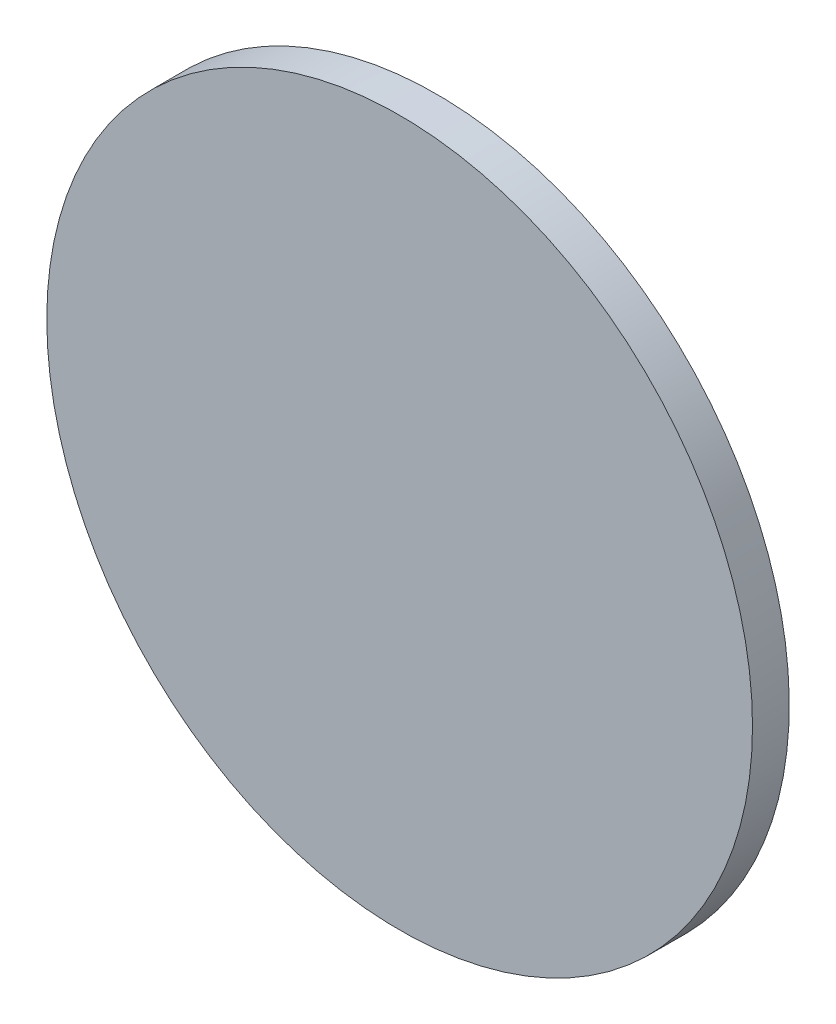
ISO-10303-21;
HEADER;
FILE_DESCRIPTION(('STEP AP214'),'2;1');
FILE_NAME('part.step','',(''),(''),'','','');
FILE_SCHEMA(('AUTOMOTIVE_DESIGN { 1 0 10303 214 1 1 1 1 }'));
ENDSEC;
DATA;
#1=APPLICATION_CONTEXT('core data for automotive mechanical design processes');
#2=APPLICATION_PROTOCOL_DEFINITION('international standard','automotive_design',2000,#1);
#3=PRODUCT_CONTEXT('',#1,'mechanical');
#4=PRODUCT('Part','Part','',(#3));
#5=PRODUCT_RELATED_PRODUCT_CATEGORY('part','',(#4));
#6=PRODUCT_DEFINITION_FORMATION('','',#4);
#7=PRODUCT_DEFINITION_CONTEXT('part definition',#1,'design');
#8=PRODUCT_DEFINITION('design','',#6,#7);
#9=PRODUCT_DEFINITION_SHAPE('','',#8);
#10=(LENGTH_UNIT() NAMED_UNIT(*) SI_UNIT(.MILLI.,.METRE.));
#11=(NAMED_UNIT(*) PLANE_ANGLE_UNIT() SI_UNIT($,.RADIAN.));
#12=(NAMED_UNIT(*) SI_UNIT($,.STERADIAN.) SOLID_ANGLE_UNIT());
#13=UNCERTAINTY_MEASURE_WITH_UNIT(LENGTH_MEASURE(1.E-05),#10,'distance_accuracy_value','');
#14=(GEOMETRIC_REPRESENTATION_CONTEXT(3) GLOBAL_UNCERTAINTY_ASSIGNED_CONTEXT((#13)) GLOBAL_UNIT_ASSIGNED_CONTEXT((#10,
#11,#12)) REPRESENTATION_CONTEXT('',''));
#15=CARTESIAN_POINT('',(0.,0.,0.));
#16=DIRECTION('',(0.,0.,1.));
#17=DIRECTION('',(1.,0.,0.));
#18=AXIS2_PLACEMENT_3D('',#15,#16,#17);
#19=CARTESIAN_POINT('',(-2.75,-32.,1.));
#20=DIRECTION('',(-1.,0.,0.));
#21=DIRECTION('',(0.,-1.,0.));
#22=AXIS2_PLACEMENT_3D('',#19,#20,#21);
#23=PLANE('',#22);
#24=DIRECTION('',(0.,0.,1.));
#25=VECTOR('',#24,1.);
#26=CARTESIAN_POINT('',(-2.75,-32.,1.));
#27=LINE('',#26,#25);
#28=CARTESIAN_POINT('',(-2.75,-32.,0.));
#29=VERTEX_POINT('',#28);
#30=CARTESIAN_POINT('',(-2.75,-32.,1.));
#31=VERTEX_POINT('',#30);
#32=EDGE_CURVE('E63',#29,#31,#27,.T.);
#33=ORIENTED_EDGE('',*,*,#32,.T.);
#34=DIRECTION('',(0.,1.,0.));
#35=VECTOR('',#34,1.);
#36=CARTESIAN_POINT('',(-2.75,-52.,1.));
#37=LINE('',#36,#35);
#38=CARTESIAN_POINT('',(-2.75,-47.9211592096853,1.));
#39=VERTEX_POINT('',#38);
#40=EDGE_CURVE('E73',#39,#31,#37,.T.);
#41=ORIENTED_EDGE('',*,*,#40,.F.);
#42=DIRECTION('',(0.,0.,1.));
#43=VECTOR('',#42,1.);
#44=CARTESIAN_POINT('',(-2.75,-47.9211592096853,1.));
#45=LINE('',#44,#43);
#46=CARTESIAN_POINT('',(-2.75,-47.9211592096853,0.));
#47=VERTEX_POINT('',#46);
#48=EDGE_CURVE('E46',#47,#39,#45,.T.);
#49=ORIENTED_EDGE('',*,*,#48,.F.);
#50=DIRECTION('',(0.,1.,0.));
#51=VECTOR('',#50,1.);
#52=CARTESIAN_POINT('',(-2.75,0.,0.));
#53=LINE('',#52,#51);
#54=EDGE_CURVE('E81',#47,#29,#53,.T.);
#55=ORIENTED_EDGE('',*,*,#54,.T.);
#56=EDGE_LOOP('',(#33,#41,#49,#55));
#57=FACE_BOUND('',#56,.T.);
#58=ADVANCED_FACE('F17',(#57),#23,.F.);
#59=CARTESIAN_POINT('',(2.75,-32.,1.));
#60=DIRECTION('',(0.,1.,0.));
#61=DIRECTION('',(0.,0.,1.));
#62=AXIS2_PLACEMENT_3D('',#59,#60,#61);
#63=PLANE('',#62);
#64=DIRECTION('',(0.,0.,1.));
#65=VECTOR('',#64,1.);
#66=CARTESIAN_POINT('',(2.75,-32.,1.));
#67=LINE('',#66,#65);
#68=CARTESIAN_POINT('',(2.75,-32.,0.));
#69=VERTEX_POINT('',#68);
#70=CARTESIAN_POINT('',(2.75,-32.,1.));
#71=VERTEX_POINT('',#70);
#72=EDGE_CURVE('E65',#69,#71,#67,.T.);
#73=ORIENTED_EDGE('',*,*,#72,.T.);
#74=DIRECTION('',(-1.,0.,0.));
#75=VECTOR('',#74,1.);
#76=CARTESIAN_POINT('',(2.75,-32.,1.));
#77=LINE('',#76,#75);
#78=EDGE_CURVE('E69',#31,#71,#77,.F.);
#79=ORIENTED_EDGE('',*,*,#78,.F.);
#80=ORIENTED_EDGE('',*,*,#32,.F.);
#81=DIRECTION('',(1.,0.,0.));
#82=VECTOR('',#81,1.);
#83=CARTESIAN_POINT('',(0.,-32.,0.));
#84=LINE('',#83,#82);
#85=EDGE_CURVE('E55',#29,#69,#84,.T.);
#86=ORIENTED_EDGE('',*,*,#85,.T.);
#87=EDGE_LOOP('',(#73,#79,#80,#86));
#88=FACE_BOUND('',#87,.T.);
#89=ADVANCED_FACE('F67',(#88),#63,.F.);
#90=CARTESIAN_POINT('',(2.75,-32.,1.));
#91=DIRECTION('',(1.,0.,0.));
#92=DIRECTION('',(0.,1.,0.));
#93=AXIS2_PLACEMENT_3D('',#90,#91,#92);
#94=PLANE('',#93);
#95=ORIENTED_EDGE('',*,*,#72,.F.);
#96=DIRECTION('',(0.,1.,0.));
#97=VECTOR('',#96,1.);
#98=CARTESIAN_POINT('',(2.75,0.,0.));
#99=LINE('',#98,#97);
#100=CARTESIAN_POINT('',(2.75,-47.9211592096853,0.));
#101=VERTEX_POINT('',#100);
#102=EDGE_CURVE('E90',#69,#101,#99,.F.);
#103=ORIENTED_EDGE('',*,*,#102,.T.);
#104=DIRECTION('',(0.,0.,1.));
#105=VECTOR('',#104,1.);
#106=CARTESIAN_POINT('',(2.75,-47.9211592096853,1.));
#107=LINE('',#106,#105);
#108=CARTESIAN_POINT('',(2.75,-47.9211592096853,1.));
#109=VERTEX_POINT('',#108);
#110=EDGE_CURVE('E74',#109,#101,#107,.F.);
#111=ORIENTED_EDGE('',*,*,#110,.F.);
#112=DIRECTION('',(0.,1.,0.));
#113=VECTOR('',#112,1.);
#114=CARTESIAN_POINT('',(2.75,-52.,1.));
#115=LINE('',#114,#113);
#116=EDGE_CURVE('E77',#71,#109,#115,.F.);
#117=ORIENTED_EDGE('',*,*,#116,.F.);
#118=EDGE_LOOP('',(#95,#103,#111,#117));
#119=FACE_BOUND('',#118,.T.);
#120=ADVANCED_FACE('F78',(#119),#94,.F.);
#121=CARTESIAN_POINT('',(2.75,-52.,1.));
#122=DIRECTION('',(0.,0.,-1.));
#123=DIRECTION('',(-1.,0.,0.));
#124=AXIS2_PLACEMENT_3D('',#121,#122,#123);
#125=PLANE('',#124);
#126=ORIENTED_EDGE('',*,*,#78,.T.);
#127=ORIENTED_EDGE('',*,*,#116,.T.);
#128=CARTESIAN_POINT('',(0.,0.,1.));
#129=DIRECTION('',(0.,0.,-1.));
#130=DIRECTION('',(-1.,0.,0.));
#131=AXIS2_PLACEMENT_3D('',#128,#129,#130);
#132=CIRCLE('',#131,48.);
#133=EDGE_CURVE('E20',#39,#109,#132,.F.);
#134=ORIENTED_EDGE('',*,*,#133,.F.);
#135=ORIENTED_EDGE('',*,*,#40,.T.);
#136=EDGE_LOOP('',(#126,#127,#134,#135));
#137=FACE_BOUND('',#136,.T.);
#138=ADVANCED_FACE('F83',(#137),#125,.T.);
#139=CARTESIAN_POINT('',(0.,0.,0.));
#140=DIRECTION('',(0.,0.,1.));
#141=DIRECTION('',(1.,0.,0.));
#142=AXIS2_PLACEMENT_3D('',#139,#140,#141);
#143=PLANE('',#142);
#144=ORIENTED_EDGE('',*,*,#102,.F.);
#145=ORIENTED_EDGE('',*,*,#85,.F.);
#146=ORIENTED_EDGE('',*,*,#54,.F.);
#147=CARTESIAN_POINT('',(0.,0.,0.));
#148=DIRECTION('',(0.,0.,-1.));
#149=DIRECTION('',(-1.,0.,0.));
#150=AXIS2_PLACEMENT_3D('',#147,#148,#149);
#151=CIRCLE('',#150,48.);
#152=EDGE_CURVE('E26',#101,#47,#151,.F.);
#153=ORIENTED_EDGE('',*,*,#152,.F.);
#154=EDGE_LOOP('',(#144,#145,#146,#153));
#155=FACE_BOUND('',#154,.T.);
#156=ADVANCED_FACE('F113',(#155),#143,.F.);
#157=CARTESIAN_POINT('',(0.,0.,5.));
#158=DIRECTION('',(0.,0.,-1.));
#159=DIRECTION('',(-1.,0.,0.));
#160=AXIS2_PLACEMENT_3D('',#157,#158,#159);
#161=CYLINDRICAL_SURFACE('',#160,48.);
#162=ORIENTED_EDGE('',*,*,#110,.T.);
#163=ORIENTED_EDGE('',*,*,#152,.T.);
#164=ORIENTED_EDGE('',*,*,#48,.T.);
#165=ORIENTED_EDGE('',*,*,#133,.T.);
#166=EDGE_LOOP('',(#162,#163,#164,#165));
#167=FACE_BOUND('',#166,.T.);
#168=CARTESIAN_POINT('',(0.,0.,5.));
#169=DIRECTION('',(0.,0.,-1.));
#170=DIRECTION('',(-1.,0.,0.));
#171=AXIS2_PLACEMENT_3D('',#168,#169,#170);
#172=CIRCLE('',#171,48.);
#173=CARTESIAN_POINT('',(-48.,0.,5.));
#174=VERTEX_POINT('',#173);
#175=EDGE_CURVE('E11',#174,#174,#172,.F.);
#176=ORIENTED_EDGE('',*,*,#175,.F.);
#177=EDGE_LOOP('',(#176));
#178=FACE_BOUND('',#177,.T.);
#179=ADVANCED_FACE('F109',(#167,#178),#161,.T.);
#180=CARTESIAN_POINT('',(0.,0.,5.));
#181=DIRECTION('',(0.,0.,1.));
#182=DIRECTION('',(1.,0.,0.));
#183=AXIS2_PLACEMENT_3D('',#180,#181,#182);
#184=PLANE('',#183);
#185=ORIENTED_EDGE('',*,*,#175,.T.);
#186=EDGE_LOOP('',(#185));
#187=FACE_BOUND('',#186,.T.);
#188=ADVANCED_FACE('F112',(#187),#184,.T.);
#189=CLOSED_SHELL('',(#58,#89,#120,#138,#156,#179,#188));
#190=MANIFOLD_SOLID_BREP('B1',#189);
#191=ADVANCED_BREP_SHAPE_REPRESENTATION('',(#18,#190),#14);
#192=SHAPE_DEFINITION_REPRESENTATION(#9,#191);
ENDSEC;
END-ISO-10303-21;
